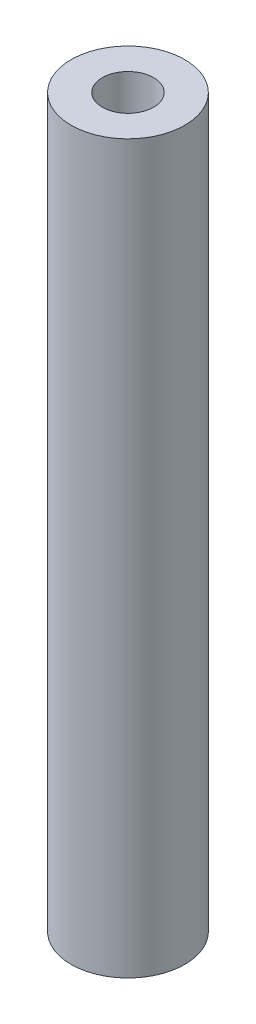
ISO-10303-21;
HEADER;
FILE_DESCRIPTION(('STEP AP214'),'2;1');
FILE_NAME('part.step','',(''),(''),'','','');
FILE_SCHEMA(('AUTOMOTIVE_DESIGN { 1 0 10303 214 1 1 1 1 }'));
ENDSEC;
DATA;
#1=APPLICATION_CONTEXT('core data for automotive mechanical design processes');
#2=APPLICATION_PROTOCOL_DEFINITION('international standard','automotive_design',2000,#1);
#3=PRODUCT_CONTEXT('',#1,'mechanical');
#4=PRODUCT('Part','Part','',(#3));
#5=PRODUCT_RELATED_PRODUCT_CATEGORY('part','',(#4));
#6=PRODUCT_DEFINITION_FORMATION('','',#4);
#7=PRODUCT_DEFINITION_CONTEXT('part definition',#1,'design');
#8=PRODUCT_DEFINITION('design','',#6,#7);
#9=PRODUCT_DEFINITION_SHAPE('','',#8);
#10=(LENGTH_UNIT() NAMED_UNIT(*) SI_UNIT(.MILLI.,.METRE.));
#11=(NAMED_UNIT(*) PLANE_ANGLE_UNIT() SI_UNIT($,.RADIAN.));
#12=(NAMED_UNIT(*) SI_UNIT($,.STERADIAN.) SOLID_ANGLE_UNIT());
#13=UNCERTAINTY_MEASURE_WITH_UNIT(LENGTH_MEASURE(1.E-05),#10,'distance_accuracy_value','');
#14=(GEOMETRIC_REPRESENTATION_CONTEXT(3) GLOBAL_UNCERTAINTY_ASSIGNED_CONTEXT((#13)) GLOBAL_UNIT_ASSIGNED_CONTEXT((#10,
#11,#12)) REPRESENTATION_CONTEXT('',''));
#15=CARTESIAN_POINT('',(0.,0.,0.));
#16=DIRECTION('',(0.,0.,1.));
#17=DIRECTION('',(1.,0.,0.));
#18=AXIS2_PLACEMENT_3D('',#15,#16,#17);
#19=CARTESIAN_POINT('',(0.,38.34,0.));
#20=DIRECTION('',(0.,-1.,0.));
#21=DIRECTION('',(0.,0.,-1.));
#22=AXIS2_PLACEMENT_3D('',#19,#20,#21);
#23=CYLINDRICAL_SURFACE('',#22,3.);
#24=CARTESIAN_POINT('',(0.,38.34,0.));
#25=DIRECTION('',(0.,1.,0.));
#26=DIRECTION('',(0.,0.,1.));
#27=AXIS2_PLACEMENT_3D('',#24,#25,#26);
#28=CIRCLE('',#27,3.);
#29=CARTESIAN_POINT('',(0.,38.34,3.));
#30=VERTEX_POINT('',#29);
#31=EDGE_CURVE('E11',#30,#30,#28,.T.);
#32=ORIENTED_EDGE('',*,*,#31,.F.);
#33=EDGE_LOOP('',(#32));
#34=FACE_BOUND('',#33,.T.);
#35=CARTESIAN_POINT('',(0.,0.,0.));
#36=DIRECTION('',(0.,1.,0.));
#37=DIRECTION('',(0.,0.,1.));
#38=AXIS2_PLACEMENT_3D('',#35,#36,#37);
#39=CIRCLE('',#38,3.);
#40=CARTESIAN_POINT('',(0.,0.,3.));
#41=VERTEX_POINT('',#40);
#42=EDGE_CURVE('E38',#41,#41,#39,.T.);
#43=ORIENTED_EDGE('',*,*,#42,.T.);
#44=EDGE_LOOP('',(#43));
#45=FACE_BOUND('',#44,.T.);
#46=ADVANCED_FACE('F35',(#34,#45),#23,.T.);
#47=CARTESIAN_POINT('',(0.,38.34,0.));
#48=DIRECTION('',(0.,1.,0.));
#49=DIRECTION('',(0.,0.,1.));
#50=AXIS2_PLACEMENT_3D('',#47,#48,#49);
#51=PLANE('',#50);
#52=CARTESIAN_POINT('',(0.,38.34,0.));
#53=DIRECTION('',(0.,1.,0.));
#54=DIRECTION('',(0.,0.,1.));
#55=AXIS2_PLACEMENT_3D('',#52,#53,#54);
#56=CIRCLE('',#55,1.35254999999999);
#57=CARTESIAN_POINT('',(0.,38.34,1.35254999999999));
#58=VERTEX_POINT('',#57);
#59=EDGE_CURVE('E58',#58,#58,#56,.T.);
#60=ORIENTED_EDGE('',*,*,#59,.F.);
#61=EDGE_LOOP('',(#60));
#62=FACE_BOUND('',#61,.T.);
#63=ORIENTED_EDGE('',*,*,#31,.T.);
#64=EDGE_LOOP('',(#63));
#65=FACE_BOUND('',#64,.T.);
#66=ADVANCED_FACE('F77',(#62,#65),#51,.T.);
#67=CARTESIAN_POINT('',(0.,0.,0.));
#68=DIRECTION('',(0.,1.,0.));
#69=DIRECTION('',(0.,0.,1.));
#70=AXIS2_PLACEMENT_3D('',#67,#68,#69);
#71=PLANE('',#70);
#72=CARTESIAN_POINT('',(0.,0.,0.));
#73=DIRECTION('',(0.,-1.,0.));
#74=DIRECTION('',(0.,0.,-1.));
#75=AXIS2_PLACEMENT_3D('',#72,#73,#74);
#76=CIRCLE('',#75,1.35254999999999);
#77=CARTESIAN_POINT('',(0.,0.,-1.35254999999999));
#78=VERTEX_POINT('',#77);
#79=EDGE_CURVE('E59',#78,#78,#76,.T.);
#80=ORIENTED_EDGE('',*,*,#79,.F.);
#81=EDGE_LOOP('',(#80));
#82=FACE_BOUND('',#81,.T.);
#83=ORIENTED_EDGE('',*,*,#42,.F.);
#84=EDGE_LOOP('',(#83));
#85=FACE_BOUND('',#84,.T.);
#86=ADVANCED_FACE('F74',(#82,#85),#71,.F.);
#87=CARTESIAN_POINT('',(0.,31.34,0.));
#88=DIRECTION('',(0.,1.,0.));
#89=DIRECTION('',(0.,0.,1.));
#90=AXIS2_PLACEMENT_3D('',#87,#88,#89);
#91=CONICAL_SURFACE('',#90,1.35255,1.02974425867665);
#92=CARTESIAN_POINT('',(0.,30.5273059697343,0.));
#93=VERTEX_POINT('',#92);
#94=VERTEX_LOOP('',#93);
#95=FACE_BOUND('',#94,.T.);
#96=CARTESIAN_POINT('',(0.,31.34,0.));
#97=DIRECTION('',(0.,1.,0.));
#98=DIRECTION('',(0.,0.,1.));
#99=AXIS2_PLACEMENT_3D('',#96,#97,#98);
#100=CIRCLE('',#99,1.35255);
#101=CARTESIAN_POINT('',(0.,31.34,1.35255));
#102=VERTEX_POINT('',#101);
#103=EDGE_CURVE('E62',#102,#102,#100,.T.);
#104=ORIENTED_EDGE('',*,*,#103,.T.);
#105=EDGE_LOOP('',(#104));
#106=FACE_BOUND('',#105,.T.);
#107=ADVANCED_FACE('F76',(#95,#106),#91,.F.);
#108=CARTESIAN_POINT('',(0.,38.34,0.));
#109=DIRECTION('',(0.,1.,0.));
#110=DIRECTION('',(0.,0.,1.));
#111=AXIS2_PLACEMENT_3D('',#108,#109,#110);
#112=CYLINDRICAL_SURFACE('',#111,1.35254999999999);
#113=ORIENTED_EDGE('',*,*,#103,.F.);
#114=EDGE_LOOP('',(#113));
#115=FACE_BOUND('',#114,.T.);
#116=ORIENTED_EDGE('',*,*,#59,.T.);
#117=EDGE_LOOP('',(#116));
#118=FACE_BOUND('',#117,.T.);
#119=ADVANCED_FACE('F52',(#115,#118),#112,.F.);
#120=CARTESIAN_POINT('',(0.,7.,0.));
#121=DIRECTION('',(0.,-1.,0.));
#122=DIRECTION('',(0.,0.,-1.));
#123=AXIS2_PLACEMENT_3D('',#120,#121,#122);
#124=CONICAL_SURFACE('',#123,1.35255,1.02974425867665);
#125=CARTESIAN_POINT('',(0.,7.81269403026573,0.));
#126=VERTEX_POINT('',#125);
#127=VERTEX_LOOP('',#126);
#128=FACE_BOUND('',#127,.T.);
#129=CARTESIAN_POINT('',(0.,7.,0.));
#130=DIRECTION('',(0.,-1.,0.));
#131=DIRECTION('',(0.,0.,-1.));
#132=AXIS2_PLACEMENT_3D('',#129,#130,#131);
#133=CIRCLE('',#132,1.35255);
#134=CARTESIAN_POINT('',(0.,7.,-1.35255));
#135=VERTEX_POINT('',#134);
#136=EDGE_CURVE('E56',#135,#135,#133,.T.);
#137=ORIENTED_EDGE('',*,*,#136,.T.);
#138=EDGE_LOOP('',(#137));
#139=FACE_BOUND('',#138,.T.);
#140=ADVANCED_FACE('F48',(#128,#139),#124,.F.);
#141=CARTESIAN_POINT('',(0.,0.,0.));
#142=DIRECTION('',(0.,-1.,0.));
#143=DIRECTION('',(0.,0.,-1.));
#144=AXIS2_PLACEMENT_3D('',#141,#142,#143);
#145=CYLINDRICAL_SURFACE('',#144,1.35254999999999);
#146=ORIENTED_EDGE('',*,*,#136,.F.);
#147=EDGE_LOOP('',(#146));
#148=FACE_BOUND('',#147,.T.);
#149=ORIENTED_EDGE('',*,*,#79,.T.);
#150=EDGE_LOOP('',(#149));
#151=FACE_BOUND('',#150,.T.);
#152=ADVANCED_FACE('F51',(#148,#151),#145,.F.);
#153=CLOSED_SHELL('',(#46,#66,#86,#107,#119,#140,#152));
#154=MANIFOLD_SOLID_BREP('B2',#153);
#155=ADVANCED_BREP_SHAPE_REPRESENTATION('',(#18,#154),#14);
#156=SHAPE_DEFINITION_REPRESENTATION(#9,#155);
ENDSEC;
END-ISO-10303-21;
